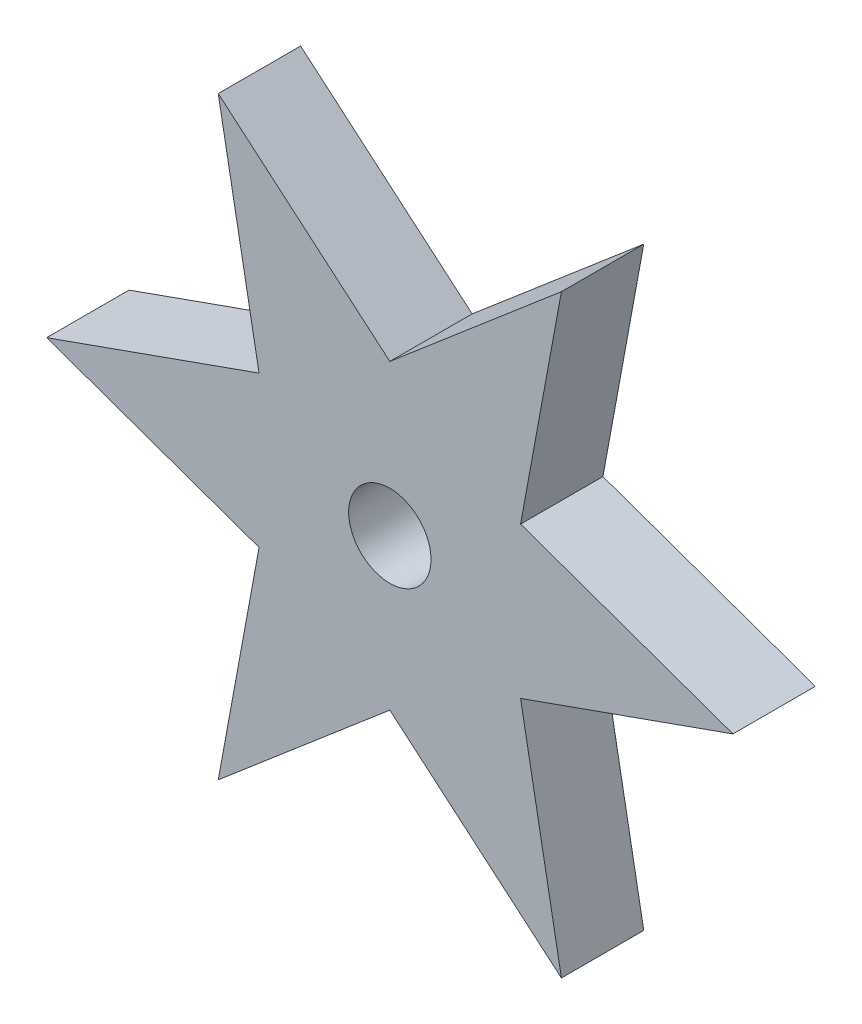
ISO-10303-21;
HEADER;
FILE_DESCRIPTION(('STEP AP214'),'2;1');
FILE_NAME('part.step','',(''),(''),'','','');
FILE_SCHEMA(('AUTOMOTIVE_DESIGN { 1 0 10303 214 1 1 1 1 }'));
ENDSEC;
DATA;
#1=APPLICATION_CONTEXT('core data for automotive mechanical design processes');
#2=APPLICATION_PROTOCOL_DEFINITION('international standard','automotive_design',2000,#1);
#3=PRODUCT_CONTEXT('',#1,'mechanical');
#4=PRODUCT('Part','Part','',(#3));
#5=PRODUCT_RELATED_PRODUCT_CATEGORY('part','',(#4));
#6=PRODUCT_DEFINITION_FORMATION('','',#4);
#7=PRODUCT_DEFINITION_CONTEXT('part definition',#1,'design');
#8=PRODUCT_DEFINITION('design','',#6,#7);
#9=PRODUCT_DEFINITION_SHAPE('','',#8);
#10=(LENGTH_UNIT() NAMED_UNIT(*) SI_UNIT(.MILLI.,.METRE.));
#11=(NAMED_UNIT(*) PLANE_ANGLE_UNIT() SI_UNIT($,.RADIAN.));
#12=(NAMED_UNIT(*) SI_UNIT($,.STERADIAN.) SOLID_ANGLE_UNIT());
#13=UNCERTAINTY_MEASURE_WITH_UNIT(LENGTH_MEASURE(1.E-05),#10,'distance_accuracy_value','');
#14=(GEOMETRIC_REPRESENTATION_CONTEXT(3) GLOBAL_UNCERTAINTY_ASSIGNED_CONTEXT((#13)) GLOBAL_UNIT_ASSIGNED_CONTEXT((#10,
#11,#12)) REPRESENTATION_CONTEXT('',''));
#15=CARTESIAN_POINT('',(0.,0.,0.));
#16=DIRECTION('',(0.,0.,1.));
#17=DIRECTION('',(1.,0.,0.));
#18=AXIS2_PLACEMENT_3D('',#15,#16,#17);
#19=CARTESIAN_POINT('',(0.,0.,3.));
#20=DIRECTION('',(0.,0.,-1.));
#21=DIRECTION('',(-1.,0.,0.));
#22=AXIS2_PLACEMENT_3D('',#19,#20,#21);
#23=PLANE('',#22);
#24=DIRECTION('',(0.94224865505113,0.334914126388149,0.));
#25=VECTOR('',#24,1.);
#26=CARTESIAN_POINT('',(4.76313972081441,-2.75,3.));
#27=LINE('',#26,#25);
#28=CARTESIAN_POINT('',(4.76313972081441,-2.75,3.));
#29=VERTEX_POINT('',#28);
#30=CARTESIAN_POINT('',(12.5,0.,3.));
#31=VERTEX_POINT('',#30);
#32=EDGE_CURVE('E183',#29,#31,#27,.T.);
#33=ORIENTED_EDGE('',*,*,#32,.T.);
#34=DIRECTION('',(-0.94224865505113,0.334914126388148,0.));
#35=VECTOR('',#34,1.);
#36=CARTESIAN_POINT('',(12.5,0.,3.));
#37=LINE('',#36,#35);
#38=CARTESIAN_POINT('',(4.76313972081441,2.75,3.));
#39=VERTEX_POINT('',#38);
#40=EDGE_CURVE('E112',#31,#39,#37,.T.);
#41=ORIENTED_EDGE('',*,*,#40,.T.);
#42=DIRECTION('',(0.181080185987156,0.983468335150073,0.));
#43=VECTOR('',#42,1.);
#44=CARTESIAN_POINT('',(4.76313972081441,2.75,3.));
#45=LINE('',#44,#43);
#46=CARTESIAN_POINT('',(6.25,10.8253175473055,3.));
#47=VERTEX_POINT('',#46);
#48=EDGE_CURVE('E208',#39,#47,#45,.T.);
#49=ORIENTED_EDGE('',*,*,#48,.T.);
#50=DIRECTION('',(-0.761168469063974,-0.648554208761925,0.));
#51=VECTOR('',#50,1.);
#52=CARTESIAN_POINT('',(6.25,10.8253175473055,3.));
#53=LINE('',#52,#51);
#54=CARTESIAN_POINT('',(0.,5.5,3.));
#55=VERTEX_POINT('',#54);
#56=EDGE_CURVE('E227',#47,#55,#53,.T.);
#57=ORIENTED_EDGE('',*,*,#56,.T.);
#58=DIRECTION('',(-0.761168469063974,0.648554208761925,0.));
#59=VECTOR('',#58,1.);
#60=CARTESIAN_POINT('',(0.,5.5,3.));
#61=LINE('',#60,#59);
#62=CARTESIAN_POINT('',(-6.25,10.8253175473055,3.));
#63=VERTEX_POINT('',#62);
#64=EDGE_CURVE('E226',#55,#63,#61,.T.);
#65=ORIENTED_EDGE('',*,*,#64,.T.);
#66=DIRECTION('',(0.181080185987156,-0.983468335150073,0.));
#67=VECTOR('',#66,1.);
#68=CARTESIAN_POINT('',(-6.25,10.8253175473055,3.));
#69=LINE('',#68,#67);
#70=CARTESIAN_POINT('',(-4.76313972081441,2.75,3.));
#71=VERTEX_POINT('',#70);
#72=EDGE_CURVE('E228',#63,#71,#69,.T.);
#73=ORIENTED_EDGE('',*,*,#72,.T.);
#74=DIRECTION('',(-0.94224865505113,-0.334914126388148,0.));
#75=VECTOR('',#74,1.);
#76=CARTESIAN_POINT('',(-4.76313972081441,2.75,3.));
#77=LINE('',#76,#75);
#78=CARTESIAN_POINT('',(-12.5,0.,3.));
#79=VERTEX_POINT('',#78);
#80=EDGE_CURVE('E231',#71,#79,#77,.T.);
#81=ORIENTED_EDGE('',*,*,#80,.T.);
#82=DIRECTION('',(0.94224865505113,-0.334914126388148,0.));
#83=VECTOR('',#82,1.);
#84=CARTESIAN_POINT('',(-12.5,0.,3.));
#85=LINE('',#84,#83);
#86=CARTESIAN_POINT('',(-4.76313972081441,-2.75,3.));
#87=VERTEX_POINT('',#86);
#88=EDGE_CURVE('E240',#79,#87,#85,.T.);
#89=ORIENTED_EDGE('',*,*,#88,.T.);
#90=DIRECTION('',(-0.181080185987157,-0.983468335150073,0.));
#91=VECTOR('',#90,1.);
#92=CARTESIAN_POINT('',(-4.76313972081441,-2.75,3.));
#93=LINE('',#92,#91);
#94=CARTESIAN_POINT('',(-6.25000000000001,-10.8253175473055,3.));
#95=VERTEX_POINT('',#94);
#96=EDGE_CURVE('E145',#87,#95,#93,.T.);
#97=ORIENTED_EDGE('',*,*,#96,.T.);
#98=DIRECTION('',(0.761168469063974,0.648554208761924,0.));
#99=VECTOR('',#98,1.);
#100=CARTESIAN_POINT('',(-6.25000000000001,-10.8253175473055,3.));
#101=LINE('',#100,#99);
#102=CARTESIAN_POINT('',(0.,-5.5,3.));
#103=VERTEX_POINT('',#102);
#104=EDGE_CURVE('E136',#95,#103,#101,.T.);
#105=ORIENTED_EDGE('',*,*,#104,.T.);
#106=DIRECTION('',(0.761168469063974,-0.648554208761925,0.));
#107=VECTOR('',#106,1.);
#108=CARTESIAN_POINT('',(0.,-5.5,3.));
#109=LINE('',#108,#107);
#110=CARTESIAN_POINT('',(6.25,-10.8253175473055,3.));
#111=VERTEX_POINT('',#110);
#112=EDGE_CURVE('E139',#103,#111,#109,.T.);
#113=ORIENTED_EDGE('',*,*,#112,.T.);
#114=DIRECTION('',(-0.181080185987157,0.983468335150073,0.));
#115=VECTOR('',#114,1.);
#116=CARTESIAN_POINT('',(6.25,-10.8253175473055,3.));
#117=LINE('',#116,#115);
#118=EDGE_CURVE('E57',#111,#29,#117,.T.);
#119=ORIENTED_EDGE('',*,*,#118,.T.);
#120=EDGE_LOOP('',(#33,#41,#49,#57,#65,#73,#81,#89,#97,#105,#113,#119));
#121=FACE_BOUND('',#120,.T.);
#122=CARTESIAN_POINT('',(0.,0.,3.));
#123=DIRECTION('',(0.,0.,1.));
#124=DIRECTION('',(1.,0.,0.));
#125=AXIS2_PLACEMENT_3D('',#122,#123,#124);
#126=CIRCLE('',#125,1.5);
#127=CARTESIAN_POINT('',(1.5,0.,3.));
#128=VERTEX_POINT('',#127);
#129=EDGE_CURVE('E161',#128,#128,#126,.T.);
#130=ORIENTED_EDGE('',*,*,#129,.F.);
#131=EDGE_LOOP('',(#130));
#132=FACE_BOUND('',#131,.T.);
#133=ADVANCED_FACE('F39',(#121,#132),#23,.F.);
#134=CARTESIAN_POINT('',(0.,0.,0.));
#135=DIRECTION('',(0.,0.,-1.));
#136=DIRECTION('',(-1.,0.,0.));
#137=AXIS2_PLACEMENT_3D('',#134,#135,#136);
#138=PLANE('',#137);
#139=DIRECTION('',(0.94224865505113,0.334914126388149,0.));
#140=VECTOR('',#139,1.);
#141=CARTESIAN_POINT('',(4.76313972081441,-2.75,0.));
#142=LINE('',#141,#140);
#143=CARTESIAN_POINT('',(4.76313972081441,-2.75,0.));
#144=VERTEX_POINT('',#143);
#145=CARTESIAN_POINT('',(12.5,0.,0.));
#146=VERTEX_POINT('',#145);
#147=EDGE_CURVE('E158',#144,#146,#142,.T.);
#148=ORIENTED_EDGE('',*,*,#147,.F.);
#149=DIRECTION('',(-0.181080185987157,0.983468335150073,0.));
#150=VECTOR('',#149,1.);
#151=CARTESIAN_POINT('',(6.25,-10.8253175473055,0.));
#152=LINE('',#151,#150);
#153=CARTESIAN_POINT('',(6.25,-10.8253175473055,0.));
#154=VERTEX_POINT('',#153);
#155=EDGE_CURVE('E104',#154,#144,#152,.T.);
#156=ORIENTED_EDGE('',*,*,#155,.F.);
#157=DIRECTION('',(0.761168469063974,-0.648554208761925,0.));
#158=VECTOR('',#157,1.);
#159=CARTESIAN_POINT('',(0.,-5.5,0.));
#160=LINE('',#159,#158);
#161=CARTESIAN_POINT('',(0.,-5.5,0.));
#162=VERTEX_POINT('',#161);
#163=EDGE_CURVE('E100',#162,#154,#160,.T.);
#164=ORIENTED_EDGE('',*,*,#163,.F.);
#165=DIRECTION('',(0.761168469063974,0.648554208761924,0.));
#166=VECTOR('',#165,1.);
#167=CARTESIAN_POINT('',(-6.25000000000001,-10.8253175473055,0.));
#168=LINE('',#167,#166);
#169=CARTESIAN_POINT('',(-6.25000000000001,-10.8253175473055,0.));
#170=VERTEX_POINT('',#169);
#171=EDGE_CURVE('E148',#170,#162,#168,.T.);
#172=ORIENTED_EDGE('',*,*,#171,.F.);
#173=DIRECTION('',(-0.181080185987157,-0.983468335150073,0.));
#174=VECTOR('',#173,1.);
#175=CARTESIAN_POINT('',(-4.76313972081441,-2.75,0.));
#176=LINE('',#175,#174);
#177=CARTESIAN_POINT('',(-4.76313972081441,-2.75,0.));
#178=VERTEX_POINT('',#177);
#179=EDGE_CURVE('E178',#178,#170,#176,.T.);
#180=ORIENTED_EDGE('',*,*,#179,.F.);
#181=DIRECTION('',(0.94224865505113,-0.334914126388148,0.));
#182=VECTOR('',#181,1.);
#183=CARTESIAN_POINT('',(-12.5,0.,0.));
#184=LINE('',#183,#182);
#185=CARTESIAN_POINT('',(-12.5,0.,0.));
#186=VERTEX_POINT('',#185);
#187=EDGE_CURVE('E176',#186,#178,#184,.T.);
#188=ORIENTED_EDGE('',*,*,#187,.F.);
#189=DIRECTION('',(-0.94224865505113,-0.334914126388148,0.));
#190=VECTOR('',#189,1.);
#191=CARTESIAN_POINT('',(-4.76313972081441,2.75,0.));
#192=LINE('',#191,#190);
#193=CARTESIAN_POINT('',(-4.76313972081441,2.75,0.));
#194=VERTEX_POINT('',#193);
#195=EDGE_CURVE('E174',#194,#186,#192,.T.);
#196=ORIENTED_EDGE('',*,*,#195,.F.);
#197=DIRECTION('',(0.181080185987156,-0.983468335150073,0.));
#198=VECTOR('',#197,1.);
#199=CARTESIAN_POINT('',(-6.25,10.8253175473055,0.));
#200=LINE('',#199,#198);
#201=CARTESIAN_POINT('',(-6.25,10.8253175473055,0.));
#202=VERTEX_POINT('',#201);
#203=EDGE_CURVE('E175',#202,#194,#200,.T.);
#204=ORIENTED_EDGE('',*,*,#203,.F.);
#205=DIRECTION('',(-0.761168469063974,0.648554208761925,0.));
#206=VECTOR('',#205,1.);
#207=CARTESIAN_POINT('',(0.,5.5,0.));
#208=LINE('',#207,#206);
#209=CARTESIAN_POINT('',(0.,5.5,0.));
#210=VERTEX_POINT('',#209);
#211=EDGE_CURVE('E169',#210,#202,#208,.T.);
#212=ORIENTED_EDGE('',*,*,#211,.F.);
#213=DIRECTION('',(-0.761168469063974,-0.648554208761925,0.));
#214=VECTOR('',#213,1.);
#215=CARTESIAN_POINT('',(6.25,10.8253175473055,0.));
#216=LINE('',#215,#214);
#217=CARTESIAN_POINT('',(6.25,10.8253175473055,0.));
#218=VERTEX_POINT('',#217);
#219=EDGE_CURVE('E166',#218,#210,#216,.T.);
#220=ORIENTED_EDGE('',*,*,#219,.F.);
#221=DIRECTION('',(0.181080185987156,0.983468335150073,0.));
#222=VECTOR('',#221,1.);
#223=CARTESIAN_POINT('',(4.76313972081441,2.75,0.));
#224=LINE('',#223,#222);
#225=CARTESIAN_POINT('',(4.76313972081441,2.75,0.));
#226=VERTEX_POINT('',#225);
#227=EDGE_CURVE('E168',#226,#218,#224,.T.);
#228=ORIENTED_EDGE('',*,*,#227,.F.);
#229=DIRECTION('',(-0.94224865505113,0.334914126388148,0.));
#230=VECTOR('',#229,1.);
#231=CARTESIAN_POINT('',(12.5,0.,0.));
#232=LINE('',#231,#230);
#233=EDGE_CURVE('E165',#146,#226,#232,.T.);
#234=ORIENTED_EDGE('',*,*,#233,.F.);
#235=EDGE_LOOP('',(#148,#156,#164,#172,#180,#188,#196,#204,#212,#220,#228,#234));
#236=FACE_BOUND('',#235,.T.);
#237=CARTESIAN_POINT('',(0.,0.,0.));
#238=DIRECTION('',(0.,0.,1.));
#239=DIRECTION('',(1.,0.,0.));
#240=AXIS2_PLACEMENT_3D('',#237,#238,#239);
#241=CIRCLE('',#240,1.5);
#242=CARTESIAN_POINT('',(1.5,0.,0.));
#243=VERTEX_POINT('',#242);
#244=EDGE_CURVE('E384',#243,#243,#241,.T.);
#245=ORIENTED_EDGE('',*,*,#244,.T.);
#246=EDGE_LOOP('',(#245));
#247=FACE_BOUND('',#246,.T.);
#248=ADVANCED_FACE('F215',(#236,#247),#138,.T.);
#249=CARTESIAN_POINT('',(4.76313972081441,-2.75,3.));
#250=DIRECTION('',(-0.334914126388149,0.94224865505113,0.));
#251=DIRECTION('',(-0.94224865505113,-0.334914126388149,0.));
#252=AXIS2_PLACEMENT_3D('',#249,#250,#251);
#253=PLANE('',#252);
#254=ORIENTED_EDGE('',*,*,#147,.T.);
#255=DIRECTION('',(0.,0.,-1.));
#256=VECTOR('',#255,1.);
#257=CARTESIAN_POINT('',(12.5,0.,3.));
#258=LINE('',#257,#256);
#259=EDGE_CURVE('E11',#31,#146,#258,.T.);
#260=ORIENTED_EDGE('',*,*,#259,.F.);
#261=ORIENTED_EDGE('',*,*,#32,.F.);
#262=DIRECTION('',(0.,0.,-1.));
#263=VECTOR('',#262,1.);
#264=CARTESIAN_POINT('',(4.76313972081441,-2.75,3.));
#265=LINE('',#264,#263);
#266=EDGE_CURVE('E157',#29,#144,#265,.T.);
#267=ORIENTED_EDGE('',*,*,#266,.T.);
#268=EDGE_LOOP('',(#254,#260,#261,#267));
#269=FACE_BOUND('',#268,.T.);
#270=ADVANCED_FACE('F41',(#269),#253,.F.);
#271=CARTESIAN_POINT('',(12.5,0.,3.));
#272=DIRECTION('',(-0.334914126388148,-0.94224865505113,0.));
#273=DIRECTION('',(0.94224865505113,-0.334914126388148,0.));
#274=AXIS2_PLACEMENT_3D('',#271,#272,#273);
#275=PLANE('',#274);
#276=ORIENTED_EDGE('',*,*,#233,.T.);
#277=DIRECTION('',(0.,0.,-1.));
#278=VECTOR('',#277,1.);
#279=CARTESIAN_POINT('',(4.76313972081441,2.75,3.));
#280=LINE('',#279,#278);
#281=EDGE_CURVE('E48',#39,#226,#280,.T.);
#282=ORIENTED_EDGE('',*,*,#281,.F.);
#283=ORIENTED_EDGE('',*,*,#40,.F.);
#284=ORIENTED_EDGE('',*,*,#259,.T.);
#285=EDGE_LOOP('',(#276,#282,#283,#284));
#286=FACE_BOUND('',#285,.T.);
#287=ADVANCED_FACE('F271',(#286),#275,.F.);
#288=CARTESIAN_POINT('',(4.76313972081441,2.75,3.));
#289=DIRECTION('',(-0.983468335150073,0.181080185987156,0.));
#290=DIRECTION('',(-0.181080185987156,-0.983468335150073,0.));
#291=AXIS2_PLACEMENT_3D('',#288,#289,#290);
#292=PLANE('',#291);
#293=ORIENTED_EDGE('',*,*,#227,.T.);
#294=DIRECTION('',(0.,0.,-1.));
#295=VECTOR('',#294,1.);
#296=CARTESIAN_POINT('',(6.25,10.8253175473055,3.));
#297=LINE('',#296,#295);
#298=EDGE_CURVE('E205',#47,#218,#297,.T.);
#299=ORIENTED_EDGE('',*,*,#298,.F.);
#300=ORIENTED_EDGE('',*,*,#48,.F.);
#301=ORIENTED_EDGE('',*,*,#281,.T.);
#302=EDGE_LOOP('',(#293,#299,#300,#301));
#303=FACE_BOUND('',#302,.T.);
#304=ADVANCED_FACE('F210',(#303),#292,.F.);
#305=CARTESIAN_POINT('',(6.25,10.8253175473055,3.));
#306=DIRECTION('',(0.648554208761925,-0.761168469063974,0.));
#307=DIRECTION('',(0.761168469063974,0.648554208761925,0.));
#308=AXIS2_PLACEMENT_3D('',#305,#306,#307);
#309=PLANE('',#308);
#310=ORIENTED_EDGE('',*,*,#219,.T.);
#311=DIRECTION('',(0.,0.,-1.));
#312=VECTOR('',#311,1.);
#313=CARTESIAN_POINT('',(0.,5.5,3.));
#314=LINE('',#313,#312);
#315=EDGE_CURVE('E196',#55,#210,#314,.T.);
#316=ORIENTED_EDGE('',*,*,#315,.F.);
#317=ORIENTED_EDGE('',*,*,#56,.F.);
#318=ORIENTED_EDGE('',*,*,#298,.T.);
#319=EDGE_LOOP('',(#310,#316,#317,#318));
#320=FACE_BOUND('',#319,.T.);
#321=ADVANCED_FACE('F217',(#320),#309,.F.);
#322=CARTESIAN_POINT('',(0.,5.5,3.));
#323=DIRECTION('',(-0.648554208761925,-0.761168469063973,0.));
#324=DIRECTION('',(0.761168469063974,-0.648554208761925,0.));
#325=AXIS2_PLACEMENT_3D('',#322,#323,#324);
#326=PLANE('',#325);
#327=ORIENTED_EDGE('',*,*,#211,.T.);
#328=DIRECTION('',(0.,0.,-1.));
#329=VECTOR('',#328,1.);
#330=CARTESIAN_POINT('',(-6.25,10.8253175473055,3.));
#331=LINE('',#330,#329);
#332=EDGE_CURVE('E197',#63,#202,#331,.T.);
#333=ORIENTED_EDGE('',*,*,#332,.F.);
#334=ORIENTED_EDGE('',*,*,#64,.F.);
#335=ORIENTED_EDGE('',*,*,#315,.T.);
#336=EDGE_LOOP('',(#327,#333,#334,#335));
#337=FACE_BOUND('',#336,.T.);
#338=ADVANCED_FACE('F222',(#337),#326,.F.);
#339=CARTESIAN_POINT('',(-6.25,10.8253175473055,3.));
#340=DIRECTION('',(0.983468335150073,0.181080185987156,0.));
#341=DIRECTION('',(-0.181080185987156,0.983468335150073,0.));
#342=AXIS2_PLACEMENT_3D('',#339,#340,#341);
#343=PLANE('',#342);
#344=ORIENTED_EDGE('',*,*,#203,.T.);
#345=DIRECTION('',(0.,0.,-1.));
#346=VECTOR('',#345,1.);
#347=CARTESIAN_POINT('',(-4.76313972081441,2.75,3.));
#348=LINE('',#347,#346);
#349=EDGE_CURVE('E194',#71,#194,#348,.T.);
#350=ORIENTED_EDGE('',*,*,#349,.F.);
#351=ORIENTED_EDGE('',*,*,#72,.F.);
#352=ORIENTED_EDGE('',*,*,#332,.T.);
#353=EDGE_LOOP('',(#344,#350,#351,#352));
#354=FACE_BOUND('',#353,.T.);
#355=ADVANCED_FACE('F281',(#354),#343,.F.);
#356=CARTESIAN_POINT('',(-4.76313972081441,2.75,3.));
#357=DIRECTION('',(0.334914126388148,-0.94224865505113,0.));
#358=DIRECTION('',(0.94224865505113,0.334914126388148,0.));
#359=AXIS2_PLACEMENT_3D('',#356,#357,#358);
#360=PLANE('',#359);
#361=ORIENTED_EDGE('',*,*,#195,.T.);
#362=DIRECTION('',(0.,0.,-1.));
#363=VECTOR('',#362,1.);
#364=CARTESIAN_POINT('',(-12.5,0.,3.));
#365=LINE('',#364,#363);
#366=EDGE_CURVE('E189',#79,#186,#365,.T.);
#367=ORIENTED_EDGE('',*,*,#366,.F.);
#368=ORIENTED_EDGE('',*,*,#80,.F.);
#369=ORIENTED_EDGE('',*,*,#349,.T.);
#370=EDGE_LOOP('',(#361,#367,#368,#369));
#371=FACE_BOUND('',#370,.T.);
#372=ADVANCED_FACE('F289',(#371),#360,.F.);
#373=CARTESIAN_POINT('',(-12.5,0.,3.));
#374=DIRECTION('',(0.334914126388149,0.94224865505113,0.));
#375=DIRECTION('',(-0.94224865505113,0.334914126388149,0.));
#376=AXIS2_PLACEMENT_3D('',#373,#374,#375);
#377=PLANE('',#376);
#378=ORIENTED_EDGE('',*,*,#187,.T.);
#379=DIRECTION('',(0.,0.,-1.));
#380=VECTOR('',#379,1.);
#381=CARTESIAN_POINT('',(-4.76313972081441,-2.75,3.));
#382=LINE('',#381,#380);
#383=EDGE_CURVE('E190',#87,#178,#382,.T.);
#384=ORIENTED_EDGE('',*,*,#383,.F.);
#385=ORIENTED_EDGE('',*,*,#88,.F.);
#386=ORIENTED_EDGE('',*,*,#366,.T.);
#387=EDGE_LOOP('',(#378,#384,#385,#386));
#388=FACE_BOUND('',#387,.T.);
#389=ADVANCED_FACE('F245',(#388),#377,.F.);
#390=CARTESIAN_POINT('',(-4.76313972081441,-2.75,3.));
#391=DIRECTION('',(0.983468335150073,-0.181080185987157,0.));
#392=DIRECTION('',(0.181080185987157,0.983468335150073,0.));
#393=AXIS2_PLACEMENT_3D('',#390,#391,#392);
#394=PLANE('',#393);
#395=ORIENTED_EDGE('',*,*,#179,.T.);
#396=DIRECTION('',(0.,0.,-1.));
#397=VECTOR('',#396,1.);
#398=CARTESIAN_POINT('',(-6.25000000000001,-10.8253175473055,3.));
#399=LINE('',#398,#397);
#400=EDGE_CURVE('E152',#95,#170,#399,.T.);
#401=ORIENTED_EDGE('',*,*,#400,.F.);
#402=ORIENTED_EDGE('',*,*,#96,.F.);
#403=ORIENTED_EDGE('',*,*,#383,.T.);
#404=EDGE_LOOP('',(#395,#401,#402,#403));
#405=FACE_BOUND('',#404,.T.);
#406=ADVANCED_FACE('F250',(#405),#394,.F.);
#407=CARTESIAN_POINT('',(-6.25000000000001,-10.8253175473055,3.));
#408=DIRECTION('',(-0.648554208761924,0.761168469063974,0.));
#409=DIRECTION('',(-0.761168469063974,-0.648554208761924,0.));
#410=AXIS2_PLACEMENT_3D('',#407,#408,#409);
#411=PLANE('',#410);
#412=ORIENTED_EDGE('',*,*,#171,.T.);
#413=DIRECTION('',(0.,0.,-1.));
#414=VECTOR('',#413,1.);
#415=CARTESIAN_POINT('',(0.,-5.5,3.));
#416=LINE('',#415,#414);
#417=EDGE_CURVE('E150',#103,#162,#416,.T.);
#418=ORIENTED_EDGE('',*,*,#417,.F.);
#419=ORIENTED_EDGE('',*,*,#104,.F.);
#420=ORIENTED_EDGE('',*,*,#400,.T.);
#421=EDGE_LOOP('',(#412,#418,#419,#420));
#422=FACE_BOUND('',#421,.T.);
#423=ADVANCED_FACE('F149',(#422),#411,.F.);
#424=CARTESIAN_POINT('',(0.,-5.5,3.));
#425=DIRECTION('',(0.648554208761925,0.761168469063974,0.));
#426=DIRECTION('',(-0.761168469063974,0.648554208761925,0.));
#427=AXIS2_PLACEMENT_3D('',#424,#425,#426);
#428=PLANE('',#427);
#429=ORIENTED_EDGE('',*,*,#163,.T.);
#430=DIRECTION('',(0.,0.,-1.));
#431=VECTOR('',#430,1.);
#432=CARTESIAN_POINT('',(6.25,-10.8253175473055,3.));
#433=LINE('',#432,#431);
#434=EDGE_CURVE('E154',#111,#154,#433,.T.);
#435=ORIENTED_EDGE('',*,*,#434,.F.);
#436=ORIENTED_EDGE('',*,*,#112,.F.);
#437=ORIENTED_EDGE('',*,*,#417,.T.);
#438=EDGE_LOOP('',(#429,#435,#436,#437));
#439=FACE_BOUND('',#438,.T.);
#440=ADVANCED_FACE('F151',(#439),#428,.F.);
#441=CARTESIAN_POINT('',(6.25,-10.8253175473055,3.));
#442=DIRECTION('',(-0.983468335150073,-0.181080185987157,0.));
#443=DIRECTION('',(0.181080185987157,-0.983468335150073,0.));
#444=AXIS2_PLACEMENT_3D('',#441,#442,#443);
#445=PLANE('',#444);
#446=ORIENTED_EDGE('',*,*,#155,.T.);
#447=ORIENTED_EDGE('',*,*,#266,.F.);
#448=ORIENTED_EDGE('',*,*,#118,.F.);
#449=ORIENTED_EDGE('',*,*,#434,.T.);
#450=EDGE_LOOP('',(#446,#447,#448,#449));
#451=FACE_BOUND('',#450,.T.);
#452=ADVANCED_FACE('F252',(#451),#445,.F.);
#453=CARTESIAN_POINT('',(0.,0.,3.));
#454=DIRECTION('',(0.,0.,-1.));
#455=DIRECTION('',(-1.,0.,0.));
#456=AXIS2_PLACEMENT_3D('',#453,#454,#455);
#457=CYLINDRICAL_SURFACE('',#456,1.5);
#458=ORIENTED_EDGE('',*,*,#129,.T.);
#459=EDGE_LOOP('',(#458));
#460=FACE_BOUND('',#459,.T.);
#461=ORIENTED_EDGE('',*,*,#244,.F.);
#462=EDGE_LOOP('',(#461));
#463=FACE_BOUND('',#462,.T.);
#464=ADVANCED_FACE('F255',(#460,#463),#457,.F.);
#465=CLOSED_SHELL('',(#133,#248,#270,#287,#304,#321,#338,#355,#372,#389,#406,#423,#440,#452,#464));
#466=MANIFOLD_SOLID_BREP('B2',#465);
#467=ADVANCED_BREP_SHAPE_REPRESENTATION('',(#18,#466),#14);
#468=SHAPE_DEFINITION_REPRESENTATION(#9,#467);
ENDSEC;
END-ISO-10303-21;
